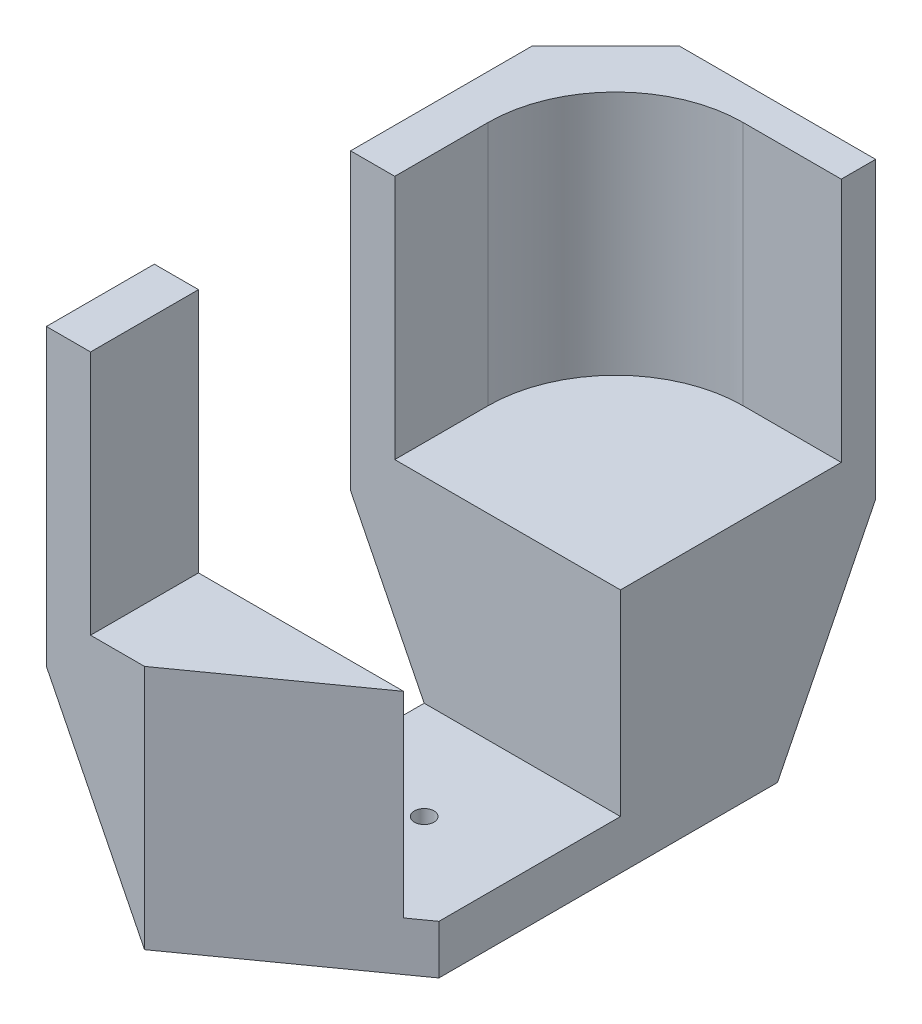
ISO-10303-21;
HEADER;
FILE_DESCRIPTION(('STEP AP214'),'2;1');
FILE_NAME('part.step','',(''),(''),'','','');
FILE_SCHEMA(('AUTOMOTIVE_DESIGN { 1 0 10303 214 1 1 1 1 }'));
ENDSEC;
DATA;
#1=APPLICATION_CONTEXT('core data for automotive mechanical design processes');
#2=APPLICATION_PROTOCOL_DEFINITION('international standard','automotive_design',2000,#1);
#3=PRODUCT_CONTEXT('',#1,'mechanical');
#4=PRODUCT('Part','Part','',(#3));
#5=PRODUCT_RELATED_PRODUCT_CATEGORY('part','',(#4));
#6=PRODUCT_DEFINITION_FORMATION('','',#4);
#7=PRODUCT_DEFINITION_CONTEXT('part definition',#1,'design');
#8=PRODUCT_DEFINITION('design','',#6,#7);
#9=PRODUCT_DEFINITION_SHAPE('','',#8);
#10=(LENGTH_UNIT() NAMED_UNIT(*) SI_UNIT(.MILLI.,.METRE.));
#11=(NAMED_UNIT(*) PLANE_ANGLE_UNIT() SI_UNIT($,.RADIAN.));
#12=(NAMED_UNIT(*) SI_UNIT($,.STERADIAN.) SOLID_ANGLE_UNIT());
#13=UNCERTAINTY_MEASURE_WITH_UNIT(LENGTH_MEASURE(1.E-05),#10,'distance_accuracy_value','');
#14=(GEOMETRIC_REPRESENTATION_CONTEXT(3) GLOBAL_UNCERTAINTY_ASSIGNED_CONTEXT((#13)) GLOBAL_UNIT_ASSIGNED_CONTEXT((#10,
#11,#12)) REPRESENTATION_CONTEXT('',''));
#15=CARTESIAN_POINT('',(0.,0.,0.));
#16=DIRECTION('',(0.,0.,1.));
#17=DIRECTION('',(1.,0.,0.));
#18=AXIS2_PLACEMENT_3D('',#15,#16,#17);
#19=CARTESIAN_POINT('',(-35.,50.,-72.));
#20=DIRECTION('',(1.,0.,0.));
#21=DIRECTION('',(0.,0.,-1.));
#22=AXIS2_PLACEMENT_3D('',#19,#20,#21);
#23=PLANE('',#22);
#24=DIRECTION('',(0.,-1.,0.));
#25=VECTOR('',#24,1.);
#26=CARTESIAN_POINT('',(-35.,50.,-57.));
#27=LINE('',#26,#25);
#28=CARTESIAN_POINT('',(-35.,100.,-57.));
#29=VERTEX_POINT('',#28);
#30=CARTESIAN_POINT('',(-35.,40.,-57.));
#31=VERTEX_POINT('',#30);
#32=EDGE_CURVE('E212',#29,#31,#27,.T.);
#33=ORIENTED_EDGE('',*,*,#32,.T.);
#34=DIRECTION('',(0.,0.,-1.));
#35=VECTOR('',#34,1.);
#36=CARTESIAN_POINT('',(-35.,40.,42.));
#37=LINE('',#36,#35);
#38=CARTESIAN_POINT('',(-35.,40.,-20.));
#39=VERTEX_POINT('',#38);
#40=EDGE_CURVE('E245',#39,#31,#37,.T.);
#41=ORIENTED_EDGE('',*,*,#40,.F.);
#42=DIRECTION('',(0.,-1.,0.));
#43=VECTOR('',#42,1.);
#44=CARTESIAN_POINT('',(-35.,100.,-20.));
#45=LINE('',#44,#43);
#46=CARTESIAN_POINT('',(-35.,100.,-20.));
#47=VERTEX_POINT('',#46);
#48=EDGE_CURVE('E262',#47,#39,#45,.T.);
#49=ORIENTED_EDGE('',*,*,#48,.F.);
#50=DIRECTION('',(0.,0.,1.));
#51=VECTOR('',#50,1.);
#52=CARTESIAN_POINT('',(-35.,100.,42.));
#53=LINE('',#52,#51);
#54=EDGE_CURVE('E290',#29,#47,#53,.T.);
#55=ORIENTED_EDGE('',*,*,#54,.F.);
#56=EDGE_LOOP('',(#33,#41,#49,#55));
#57=FACE_BOUND('',#56,.T.);
#58=ADVANCED_FACE('F41',(#57),#23,.F.);
#59=CARTESIAN_POINT('',(0.,50.,0.));
#60=DIRECTION('',(0.,1.,0.));
#61=DIRECTION('',(0.,0.,1.));
#62=AXIS2_PLACEMENT_3D('',#59,#60,#61);
#63=PLANE('',#62);
#64=DIRECTION('',(0.813733471206735,0.,-0.581238193719097));
#65=VECTOR('',#64,1.);
#66=CARTESIAN_POINT('',(-15.,50.,42.));
#67=LINE('',#66,#65);
#68=CARTESIAN_POINT('',(-15.,50.,42.));
#69=VERTEX_POINT('',#68);
#70=CARTESIAN_POINT('',(15.8,50.,20.));
#71=VERTEX_POINT('',#70);
#72=EDGE_CURVE('E196',#69,#71,#67,.T.);
#73=ORIENTED_EDGE('',*,*,#72,.T.);
#74=DIRECTION('',(-1.,0.,0.));
#75=VECTOR('',#74,1.);
#76=CARTESIAN_POINT('',(0.,50.,20.));
#77=LINE('',#76,#75);
#78=CARTESIAN_POINT('',(-26.,50.,20.));
#79=VERTEX_POINT('',#78);
#80=EDGE_CURVE('E278',#71,#79,#77,.T.);
#81=ORIENTED_EDGE('',*,*,#80,.T.);
#82=DIRECTION('',(0.,0.,-1.));
#83=VECTOR('',#82,1.);
#84=CARTESIAN_POINT('',(-26.,50.,-39.));
#85=LINE('',#84,#83);
#86=CARTESIAN_POINT('',(-26.,50.,42.));
#87=VERTEX_POINT('',#86);
#88=EDGE_CURVE('E310',#87,#79,#85,.T.);
#89=ORIENTED_EDGE('',*,*,#88,.F.);
#90=DIRECTION('',(1.,0.,0.));
#91=VECTOR('',#90,1.);
#92=CARTESIAN_POINT('',(-35.,50.,42.));
#93=LINE('',#92,#91);
#94=EDGE_CURVE('E193',#87,#69,#93,.T.);
#95=ORIENTED_EDGE('',*,*,#94,.T.);
#96=EDGE_LOOP('',(#73,#81,#89,#95));
#97=FACE_BOUND('',#96,.T.);
#98=ADVANCED_FACE('F380',(#97),#63,.T.);
#99=CARTESIAN_POINT('',(-26.,50.,-20.));
#100=VERTEX_POINT('',#99);
#101=CARTESIAN_POINT('',(-26.,50.,-39.));
#102=VERTEX_POINT('',#101);
#103=EDGE_CURVE('E284',#100,#102,#85,.T.);
#104=ORIENTED_EDGE('',*,*,#103,.F.);
#105=DIRECTION('',(1.,0.,0.));
#106=VECTOR('',#105,1.);
#107=CARTESIAN_POINT('',(0.,50.,-20.));
#108=LINE('',#107,#106);
#109=CARTESIAN_POINT('',(20.,50.,-20.));
#110=VERTEX_POINT('',#109);
#111=EDGE_CURVE('E273',#100,#110,#108,.T.);
#112=ORIENTED_EDGE('',*,*,#111,.T.);
#113=DIRECTION('',(0.,0.,-1.));
#114=VECTOR('',#113,1.);
#115=CARTESIAN_POINT('',(20.,50.,17.));
#116=LINE('',#115,#114);
#117=CARTESIAN_POINT('',(20.,50.,-65.));
#118=VERTEX_POINT('',#117);
#119=EDGE_CURVE('E204',#110,#118,#116,.T.);
#120=ORIENTED_EDGE('',*,*,#119,.T.);
#121=DIRECTION('',(1.,0.,0.));
#122=VECTOR('',#121,1.);
#123=CARTESIAN_POINT('',(20.,50.,-65.));
#124=LINE('',#123,#122);
#125=CARTESIAN_POINT('',(0.,50.,-65.));
#126=VERTEX_POINT('',#125);
#127=EDGE_CURVE('E289',#126,#118,#124,.T.);
#128=ORIENTED_EDGE('',*,*,#127,.F.);
#129=CARTESIAN_POINT('',(0.,50.,-39.));
#130=DIRECTION('',(0.,-1.,0.));
#131=DIRECTION('',(0.,0.,1.));
#132=AXIS2_PLACEMENT_3D('',#129,#130,#131);
#133=CIRCLE('',#132,26.);
#134=EDGE_CURVE('E313',#102,#126,#133,.T.);
#135=ORIENTED_EDGE('',*,*,#134,.F.);
#136=EDGE_LOOP('',(#104,#112,#120,#128,#135));
#137=FACE_BOUND('',#136,.T.);
#138=ADVANCED_FACE('F335',(#137),#63,.T.);
#139=DIRECTION('',(0.,-1.,0.));
#140=VECTOR('',#139,1.);
#141=CARTESIAN_POINT('',(-35.,100.,20.));
#142=LINE('',#141,#140);
#143=CARTESIAN_POINT('',(-35.,100.,20.));
#144=VERTEX_POINT('',#143);
#145=CARTESIAN_POINT('',(-35.,40.,20.));
#146=VERTEX_POINT('',#145);
#147=EDGE_CURVE('E268',#144,#146,#142,.T.);
#148=ORIENTED_EDGE('',*,*,#147,.T.);
#149=CARTESIAN_POINT('',(-35.,40.,42.));
#150=VERTEX_POINT('',#149);
#151=EDGE_CURVE('E241',#150,#146,#37,.T.);
#152=ORIENTED_EDGE('',*,*,#151,.F.);
#153=DIRECTION('',(0.,-1.,0.));
#154=VECTOR('',#153,1.);
#155=CARTESIAN_POINT('',(-35.,50.,42.));
#156=LINE('',#155,#154);
#157=CARTESIAN_POINT('',(-35.,100.,42.));
#158=VERTEX_POINT('',#157);
#159=EDGE_CURVE('E209',#158,#150,#156,.T.);
#160=ORIENTED_EDGE('',*,*,#159,.F.);
#161=EDGE_CURVE('E288',#144,#158,#53,.T.);
#162=ORIENTED_EDGE('',*,*,#161,.F.);
#163=EDGE_LOOP('',(#148,#152,#160,#162));
#164=FACE_BOUND('',#163,.T.);
#165=ADVANCED_FACE('F382',(#164),#23,.F.);
#166=CARTESIAN_POINT('',(-15.,50.,42.));
#167=DIRECTION('',(-0.581238193719097,0.,-0.813733471206735));
#168=DIRECTION('',(-0.813733471206735,0.,0.581238193719097));
#169=AXIS2_PLACEMENT_3D('',#166,#167,#168);
#170=PLANE('',#169);
#171=DIRECTION('',(0.,-1.,0.));
#172=VECTOR('',#171,1.);
#173=CARTESIAN_POINT('',(15.8,50.,20.));
#174=LINE('',#173,#172);
#175=CARTESIAN_POINT('',(15.8,10.,20.));
#176=VERTEX_POINT('',#175);
#177=EDGE_CURVE('E225',#71,#176,#174,.T.);
#178=ORIENTED_EDGE('',*,*,#177,.F.);
#179=ORIENTED_EDGE('',*,*,#72,.F.);
#180=DIRECTION('',(0.,-1.,0.));
#181=VECTOR('',#180,1.);
#182=CARTESIAN_POINT('',(-15.,50.,42.));
#183=LINE('',#182,#181);
#184=CARTESIAN_POINT('',(-15.,0.,42.));
#185=VERTEX_POINT('',#184);
#186=EDGE_CURVE('E206',#69,#185,#183,.T.);
#187=ORIENTED_EDGE('',*,*,#186,.T.);
#188=DIRECTION('',(0.813733471206735,0.,-0.581238193719097));
#189=VECTOR('',#188,1.);
#190=CARTESIAN_POINT('',(-15.,0.,42.));
#191=LINE('',#190,#189);
#192=CARTESIAN_POINT('',(20.,0.,17.));
#193=VERTEX_POINT('',#192);
#194=EDGE_CURVE('E194',#185,#193,#191,.T.);
#195=ORIENTED_EDGE('',*,*,#194,.T.);
#196=DIRECTION('',(0.,-1.,0.));
#197=VECTOR('',#196,1.);
#198=CARTESIAN_POINT('',(20.,50.,17.));
#199=LINE('',#198,#197);
#200=CARTESIAN_POINT('',(20.,10.,17.));
#201=VERTEX_POINT('',#200);
#202=EDGE_CURVE('E192',#201,#193,#199,.T.);
#203=ORIENTED_EDGE('',*,*,#202,.F.);
#204=DIRECTION('',(0.813733471206735,0.,-0.581238193719097));
#205=VECTOR('',#204,1.);
#206=CARTESIAN_POINT('',(-15.,10.,42.));
#207=LINE('',#206,#205);
#208=EDGE_CURVE('E224',#176,#201,#207,.T.);
#209=ORIENTED_EDGE('',*,*,#208,.F.);
#210=EDGE_LOOP('',(#178,#179,#187,#195,#203,#209));
#211=FACE_BOUND('',#210,.T.);
#212=ADVANCED_FACE('F391',(#211),#170,.F.);
#213=CARTESIAN_POINT('',(20.,50.,-14.0255727499082));
#214=DIRECTION('',(-1.,0.,0.));
#215=DIRECTION('',(0.,0.,1.));
#216=AXIS2_PLACEMENT_3D('',#213,#214,#215);
#217=PLANE('',#216);
#218=DIRECTION('',(0.,0.,-1.));
#219=VECTOR('',#218,1.);
#220=CARTESIAN_POINT('',(20.,0.,-14.0255727499082));
#221=LINE('',#220,#219);
#222=CARTESIAN_POINT('',(20.,0.,-52.));
#223=VERTEX_POINT('',#222);
#224=EDGE_CURVE('E178',#193,#223,#221,.T.);
#225=ORIENTED_EDGE('',*,*,#224,.T.);
#226=DIRECTION('',(0.,-0.894427190999916,0.447213595499958));
#227=VECTOR('',#226,1.);
#228=CARTESIAN_POINT('',(20.,40.,-72.));
#229=LINE('',#228,#227);
#230=CARTESIAN_POINT('',(20.,40.,-72.));
#231=VERTEX_POINT('',#230);
#232=EDGE_CURVE('E181',#231,#223,#229,.T.);
#233=ORIENTED_EDGE('',*,*,#232,.F.);
#234=DIRECTION('',(0.,-1.,0.));
#235=VECTOR('',#234,1.);
#236=CARTESIAN_POINT('',(20.,50.,-72.));
#237=LINE('',#236,#235);
#238=CARTESIAN_POINT('',(20.,100.,-72.));
#239=VERTEX_POINT('',#238);
#240=EDGE_CURVE('E202',#239,#231,#237,.T.);
#241=ORIENTED_EDGE('',*,*,#240,.F.);
#242=DIRECTION('',(0.,0.,-1.));
#243=VECTOR('',#242,1.);
#244=CARTESIAN_POINT('',(20.,100.,-72.));
#245=LINE('',#244,#243);
#246=CARTESIAN_POINT('',(20.,100.,-65.));
#247=VERTEX_POINT('',#246);
#248=EDGE_CURVE('E303',#247,#239,#245,.T.);
#249=ORIENTED_EDGE('',*,*,#248,.F.);
#250=DIRECTION('',(0.,-1.,0.));
#251=VECTOR('',#250,1.);
#252=CARTESIAN_POINT('',(20.,100.,-65.));
#253=LINE('',#252,#251);
#254=EDGE_CURVE('E309',#247,#118,#253,.T.);
#255=ORIENTED_EDGE('',*,*,#254,.T.);
#256=ORIENTED_EDGE('',*,*,#119,.F.);
#257=DIRECTION('',(0.,-1.,0.));
#258=VECTOR('',#257,1.);
#259=CARTESIAN_POINT('',(20.,100.,-20.));
#260=LINE('',#259,#258);
#261=CARTESIAN_POINT('',(20.,10.,-20.));
#262=VERTEX_POINT('',#261);
#263=EDGE_CURVE('E265',#110,#262,#260,.T.);
#264=ORIENTED_EDGE('',*,*,#263,.T.);
#265=DIRECTION('',(0.,0.,-1.));
#266=VECTOR('',#265,1.);
#267=CARTESIAN_POINT('',(20.,10.,-20.));
#268=LINE('',#267,#266);
#269=EDGE_CURVE('E255',#201,#262,#268,.T.);
#270=ORIENTED_EDGE('',*,*,#269,.F.);
#271=ORIENTED_EDGE('',*,*,#202,.T.);
#272=EDGE_LOOP('',(#225,#233,#241,#249,#255,#256,#264,#270,#271));
#273=FACE_BOUND('',#272,.T.);
#274=ADVANCED_FACE('F189',(#273),#217,.F.);
#275=CARTESIAN_POINT('',(0.,50.,0.));
#276=DIRECTION('',(0.,-1.,0.));
#277=DIRECTION('',(0.,0.,-1.));
#278=AXIS2_PLACEMENT_3D('',#275,#276,#277);
#279=CYLINDRICAL_SURFACE('',#278,2.);
#280=CARTESIAN_POINT('',(0.,0.,0.));
#281=DIRECTION('',(0.,1.,0.));
#282=DIRECTION('',(0.,0.,1.));
#283=AXIS2_PLACEMENT_3D('',#280,#281,#282);
#284=CIRCLE('',#283,2.);
#285=CARTESIAN_POINT('',(0.,0.,2.));
#286=VERTEX_POINT('',#285);
#287=EDGE_CURVE('E198',#286,#286,#284,.T.);
#288=ORIENTED_EDGE('',*,*,#287,.F.);
#289=EDGE_LOOP('',(#288));
#290=FACE_BOUND('',#289,.T.);
#291=CARTESIAN_POINT('',(0.,10.,0.));
#292=DIRECTION('',(0.,1.,0.));
#293=DIRECTION('',(0.,0.,1.));
#294=AXIS2_PLACEMENT_3D('',#291,#292,#293);
#295=CIRCLE('',#294,2.);
#296=CARTESIAN_POINT('',(0.,10.,2.));
#297=VERTEX_POINT('',#296);
#298=EDGE_CURVE('E221',#297,#297,#295,.T.);
#299=ORIENTED_EDGE('',*,*,#298,.T.);
#300=EDGE_LOOP('',(#299));
#301=FACE_BOUND('',#300,.T.);
#302=ADVANCED_FACE('F449',(#290,#301),#279,.F.);
#303=CARTESIAN_POINT('',(-26.,100.,-39.));
#304=DIRECTION('',(-1.,0.,0.));
#305=DIRECTION('',(0.,0.,1.));
#306=AXIS2_PLACEMENT_3D('',#303,#304,#305);
#307=PLANE('',#306);
#308=DIRECTION('',(0.,-1.,0.));
#309=VECTOR('',#308,1.);
#310=CARTESIAN_POINT('',(-26.,100.,20.));
#311=LINE('',#310,#309);
#312=CARTESIAN_POINT('',(-26.,100.,20.));
#313=VERTEX_POINT('',#312);
#314=EDGE_CURVE('E276',#313,#79,#311,.T.);
#315=ORIENTED_EDGE('',*,*,#314,.F.);
#316=DIRECTION('',(0.,0.,-1.));
#317=VECTOR('',#316,1.);
#318=CARTESIAN_POINT('',(-26.,100.,-39.));
#319=LINE('',#318,#317);
#320=CARTESIAN_POINT('',(-26.,100.,42.));
#321=VERTEX_POINT('',#320);
#322=EDGE_CURVE('E296',#321,#313,#319,.T.);
#323=ORIENTED_EDGE('',*,*,#322,.F.);
#324=DIRECTION('',(0.,-1.,0.));
#325=VECTOR('',#324,1.);
#326=CARTESIAN_POINT('',(-26.,100.,42.));
#327=LINE('',#326,#325);
#328=EDGE_CURVE('E326',#321,#87,#327,.T.);
#329=ORIENTED_EDGE('',*,*,#328,.T.);
#330=ORIENTED_EDGE('',*,*,#88,.T.);
#331=EDGE_LOOP('',(#315,#323,#329,#330));
#332=FACE_BOUND('',#331,.T.);
#333=ADVANCED_FACE('F414',(#332),#307,.F.);
#334=DIRECTION('',(0.,1.,0.));
#335=VECTOR('',#334,1.);
#336=CARTESIAN_POINT('',(-26.,100.,-20.));
#337=LINE('',#336,#335);
#338=CARTESIAN_POINT('',(-26.,100.,-20.));
#339=VERTEX_POINT('',#338);
#340=EDGE_CURVE('E271',#100,#339,#337,.T.);
#341=ORIENTED_EDGE('',*,*,#340,.F.);
#342=ORIENTED_EDGE('',*,*,#103,.T.);
#343=DIRECTION('',(0.,-1.,0.));
#344=VECTOR('',#343,1.);
#345=CARTESIAN_POINT('',(-26.,100.,-39.));
#346=LINE('',#345,#344);
#347=CARTESIAN_POINT('',(-26.,100.,-39.));
#348=VERTEX_POINT('',#347);
#349=EDGE_CURVE('E323',#348,#102,#346,.T.);
#350=ORIENTED_EDGE('',*,*,#349,.F.);
#351=EDGE_CURVE('E295',#339,#348,#319,.T.);
#352=ORIENTED_EDGE('',*,*,#351,.F.);
#353=EDGE_LOOP('',(#341,#342,#350,#352));
#354=FACE_BOUND('',#353,.T.);
#355=ADVANCED_FACE('F364',(#354),#307,.F.);
#356=CARTESIAN_POINT('',(0.,100.,-39.));
#357=DIRECTION('',(0.,1.,0.));
#358=DIRECTION('',(0.,0.,1.));
#359=AXIS2_PLACEMENT_3D('',#356,#357,#358);
#360=PLANE('',#359);
#361=ORIENTED_EDGE('',*,*,#322,.T.);
#362=DIRECTION('',(1.,0.,0.));
#363=VECTOR('',#362,1.);
#364=CARTESIAN_POINT('',(-35.,100.,20.));
#365=LINE('',#364,#363);
#366=EDGE_CURVE('E260',#144,#313,#365,.T.);
#367=ORIENTED_EDGE('',*,*,#366,.F.);
#368=ORIENTED_EDGE('',*,*,#161,.T.);
#369=DIRECTION('',(1.,0.,0.));
#370=VECTOR('',#369,1.);
#371=CARTESIAN_POINT('',(-26.,100.,42.));
#372=LINE('',#371,#370);
#373=EDGE_CURVE('E293',#158,#321,#372,.T.);
#374=ORIENTED_EDGE('',*,*,#373,.T.);
#375=EDGE_LOOP('',(#361,#367,#368,#374));
#376=FACE_BOUND('',#375,.T.);
#377=ADVANCED_FACE('F409',(#376),#360,.T.);
#378=ORIENTED_EDGE('',*,*,#54,.T.);
#379=DIRECTION('',(1.,0.,0.));
#380=VECTOR('',#379,1.);
#381=CARTESIAN_POINT('',(0.,100.,-20.));
#382=LINE('',#381,#380);
#383=EDGE_CURVE('E217',#47,#339,#382,.T.);
#384=ORIENTED_EDGE('',*,*,#383,.T.);
#385=ORIENTED_EDGE('',*,*,#351,.T.);
#386=CARTESIAN_POINT('',(0.,100.,-39.));
#387=DIRECTION('',(0.,-1.,0.));
#388=DIRECTION('',(0.,0.,1.));
#389=AXIS2_PLACEMENT_3D('',#386,#387,#388);
#390=CIRCLE('',#389,26.);
#391=CARTESIAN_POINT('',(0.,100.,-65.));
#392=VERTEX_POINT('',#391);
#393=EDGE_CURVE('E299',#348,#392,#390,.T.);
#394=ORIENTED_EDGE('',*,*,#393,.T.);
#395=DIRECTION('',(1.,0.,0.));
#396=VECTOR('',#395,1.);
#397=CARTESIAN_POINT('',(20.,100.,-65.));
#398=LINE('',#397,#396);
#399=EDGE_CURVE('E301',#392,#247,#398,.T.);
#400=ORIENTED_EDGE('',*,*,#399,.T.);
#401=ORIENTED_EDGE('',*,*,#248,.T.);
#402=DIRECTION('',(-1.,0.,0.));
#403=VECTOR('',#402,1.);
#404=CARTESIAN_POINT('',(-20.,100.,-72.));
#405=LINE('',#404,#403);
#406=CARTESIAN_POINT('',(-20.,100.,-72.));
#407=VERTEX_POINT('',#406);
#408=EDGE_CURVE('E306',#239,#407,#405,.T.);
#409=ORIENTED_EDGE('',*,*,#408,.T.);
#410=DIRECTION('',(-0.707106781186549,0.,0.707106781186546));
#411=VECTOR('',#410,1.);
#412=CARTESIAN_POINT('',(-35.,100.,-57.));
#413=LINE('',#412,#411);
#414=EDGE_CURVE('E285',#407,#29,#413,.T.);
#415=ORIENTED_EDGE('',*,*,#414,.T.);
#416=EDGE_LOOP('',(#378,#384,#385,#394,#400,#401,#409,#415));
#417=FACE_BOUND('',#416,.T.);
#418=ADVANCED_FACE('F345',(#417),#360,.T.);
#419=CARTESIAN_POINT('',(0.,0.,0.));
#420=DIRECTION('',(0.,1.,0.));
#421=DIRECTION('',(0.,0.,1.));
#422=AXIS2_PLACEMENT_3D('',#419,#420,#421);
#423=PLANE('',#422);
#424=DIRECTION('',(0.,0.,-1.));
#425=VECTOR('',#424,1.);
#426=CARTESIAN_POINT('',(-15.,0.,42.));
#427=LINE('',#426,#425);
#428=CARTESIAN_POINT('',(-15.,0.,-37.0000700401634));
#429=VERTEX_POINT('',#428);
#430=EDGE_CURVE('E234',#185,#429,#427,.T.);
#431=ORIENTED_EDGE('',*,*,#430,.T.);
#432=DIRECTION('',(-0.707106781186547,0.,0.707106781186548));
#433=VECTOR('',#432,1.);
#434=CARTESIAN_POINT('',(-15.,0.,-37.0000700401634));
#435=LINE('',#434,#433);
#436=CARTESIAN_POINT('',(-7.00401634745607E-05,0.,-52.));
#437=VERTEX_POINT('',#436);
#438=EDGE_CURVE('E64',#429,#437,#435,.F.);
#439=ORIENTED_EDGE('',*,*,#438,.T.);
#440=DIRECTION('',(1.,0.,0.));
#441=VECTOR('',#440,1.);
#442=CARTESIAN_POINT('',(-35.,0.,-52.));
#443=LINE('',#442,#441);
#444=EDGE_CURVE('E172',#437,#223,#443,.T.);
#445=ORIENTED_EDGE('',*,*,#444,.T.);
#446=ORIENTED_EDGE('',*,*,#224,.F.);
#447=ORIENTED_EDGE('',*,*,#194,.F.);
#448=EDGE_LOOP('',(#431,#439,#445,#446,#447));
#449=FACE_BOUND('',#448,.T.);
#450=ORIENTED_EDGE('',*,*,#287,.T.);
#451=EDGE_LOOP('',(#450));
#452=FACE_BOUND('',#451,.T.);
#453=ADVANCED_FACE('F174',(#449,#452),#423,.F.);
#454=CARTESIAN_POINT('',(20.,50.,-72.));
#455=DIRECTION('',(0.,0.,1.));
#456=DIRECTION('',(1.,0.,0.));
#457=AXIS2_PLACEMENT_3D('',#454,#455,#456);
#458=PLANE('',#457);
#459=ORIENTED_EDGE('',*,*,#240,.T.);
#460=DIRECTION('',(1.,0.,0.));
#461=VECTOR('',#460,1.);
#462=CARTESIAN_POINT('',(-35.,40.,-72.));
#463=LINE('',#462,#461);
#464=CARTESIAN_POINT('',(-20.,40.,-72.));
#465=VERTEX_POINT('',#464);
#466=EDGE_CURVE('E180',#465,#231,#463,.T.);
#467=ORIENTED_EDGE('',*,*,#466,.F.);
#468=DIRECTION('',(0.,1.,0.));
#469=VECTOR('',#468,1.);
#470=CARTESIAN_POINT('',(-20.,50.,-72.));
#471=LINE('',#470,#469);
#472=EDGE_CURVE('E215',#465,#407,#471,.T.);
#473=ORIENTED_EDGE('',*,*,#472,.T.);
#474=ORIENTED_EDGE('',*,*,#408,.F.);
#475=EDGE_LOOP('',(#459,#467,#473,#474));
#476=FACE_BOUND('',#475,.T.);
#477=ADVANCED_FACE('F348',(#476),#458,.F.);
#478=CARTESIAN_POINT('',(-35.,50.,42.));
#479=DIRECTION('',(0.,0.,-1.));
#480=DIRECTION('',(-1.,0.,0.));
#481=AXIS2_PLACEMENT_3D('',#478,#479,#480);
#482=PLANE('',#481);
#483=ORIENTED_EDGE('',*,*,#159,.T.);
#484=DIRECTION('',(0.447213595499958,-0.894427190999916,0.));
#485=VECTOR('',#484,1.);
#486=CARTESIAN_POINT('',(-15.,0.,42.));
#487=LINE('',#486,#485);
#488=EDGE_CURVE('E248',#150,#185,#487,.T.);
#489=ORIENTED_EDGE('',*,*,#488,.T.);
#490=ORIENTED_EDGE('',*,*,#186,.F.);
#491=ORIENTED_EDGE('',*,*,#94,.F.);
#492=ORIENTED_EDGE('',*,*,#328,.F.);
#493=ORIENTED_EDGE('',*,*,#373,.F.);
#494=EDGE_LOOP('',(#483,#489,#490,#491,#492,#493));
#495=FACE_BOUND('',#494,.T.);
#496=ADVANCED_FACE('F377',(#495),#482,.F.);
#497=CARTESIAN_POINT('',(-35.,50.,-57.));
#498=DIRECTION('',(0.707106781186546,0.,0.707106781186549));
#499=DIRECTION('',(0.,-1.,0.));
#500=AXIS2_PLACEMENT_3D('',#497,#498,#499);
#501=PLANE('',#500);
#502=DIRECTION('',(-0.408248290463864,-0.816496580927725,0.408248290463863));
#503=VECTOR('',#502,1.);
#504=CARTESIAN_POINT('',(-21.6666666666667,36.6666666666666,-70.3333333333333));
#505=LINE('',#504,#503);
#506=CARTESIAN_POINT('',(-20.0000350200817,39.9999299598365,-71.9999649799182));
#507=VERTEX_POINT('',#506);
#508=EDGE_CURVE('E352',#507,#465,#505,.F.);
#509=ORIENTED_EDGE('',*,*,#508,.F.);
#510=DIRECTION('',(-0.707106781186549,0.,0.707106781186546));
#511=VECTOR('',#510,1.);
#512=CARTESIAN_POINT('',(-35.,39.9999299598366,-57.));
#513=LINE('',#512,#511);
#514=CARTESIAN_POINT('',(-34.9999649799183,39.9999299598366,-57.0000350200817));
#515=VERTEX_POINT('',#514);
#516=EDGE_CURVE('E11',#507,#515,#513,.T.);
#517=ORIENTED_EDGE('',*,*,#516,.T.);
#518=DIRECTION('',(-0.408248290463863,0.816496580927727,0.408248290463862));
#519=VECTOR('',#518,1.);
#520=CARTESIAN_POINT('',(-38.3333333333333,46.6666666666667,-53.6666666666667));
#521=LINE('',#520,#519);
#522=EDGE_CURVE('E237',#31,#515,#521,.F.);
#523=ORIENTED_EDGE('',*,*,#522,.F.);
#524=ORIENTED_EDGE('',*,*,#32,.F.);
#525=ORIENTED_EDGE('',*,*,#414,.F.);
#526=ORIENTED_EDGE('',*,*,#472,.F.);
#527=EDGE_LOOP('',(#509,#517,#523,#524,#525,#526));
#528=FACE_BOUND('',#527,.T.);
#529=ADVANCED_FACE('F351',(#528),#501,.F.);
#530=CARTESIAN_POINT('',(0.,100.,-39.));
#531=DIRECTION('',(0.,-1.,0.));
#532=DIRECTION('',(0.,0.,-1.));
#533=AXIS2_PLACEMENT_3D('',#530,#531,#532);
#534=CYLINDRICAL_SURFACE('',#533,26.);
#535=ORIENTED_EDGE('',*,*,#134,.T.);
#536=DIRECTION('',(0.,-1.,0.));
#537=VECTOR('',#536,1.);
#538=CARTESIAN_POINT('',(0.,100.,-65.));
#539=LINE('',#538,#537);
#540=EDGE_CURVE('E320',#392,#126,#539,.T.);
#541=ORIENTED_EDGE('',*,*,#540,.F.);
#542=ORIENTED_EDGE('',*,*,#393,.F.);
#543=ORIENTED_EDGE('',*,*,#349,.T.);
#544=EDGE_LOOP('',(#535,#541,#542,#543));
#545=FACE_BOUND('',#544,.T.);
#546=ADVANCED_FACE('F368',(#545),#534,.F.);
#547=CARTESIAN_POINT('',(20.,100.,-65.));
#548=DIRECTION('',(0.,0.,-1.));
#549=DIRECTION('',(-1.,0.,0.));
#550=AXIS2_PLACEMENT_3D('',#547,#548,#549);
#551=PLANE('',#550);
#552=ORIENTED_EDGE('',*,*,#127,.T.);
#553=ORIENTED_EDGE('',*,*,#254,.F.);
#554=ORIENTED_EDGE('',*,*,#399,.F.);
#555=ORIENTED_EDGE('',*,*,#540,.T.);
#556=EDGE_LOOP('',(#552,#553,#554,#555));
#557=FACE_BOUND('',#556,.T.);
#558=ADVANCED_FACE('F339',(#557),#551,.F.);
#559=CARTESIAN_POINT('',(0.,10.,0.));
#560=DIRECTION('',(0.,1.,0.));
#561=DIRECTION('',(0.,0.,1.));
#562=AXIS2_PLACEMENT_3D('',#559,#560,#561);
#563=PLANE('',#562);
#564=DIRECTION('',(0.,0.,-1.));
#565=VECTOR('',#564,1.);
#566=CARTESIAN_POINT('',(-20.,10.,0.));
#567=LINE('',#566,#565);
#568=CARTESIAN_POINT('',(-20.,10.,20.));
#569=VERTEX_POINT('',#568);
#570=CARTESIAN_POINT('',(-20.,9.99999999999998,-20.));
#571=VERTEX_POINT('',#570);
#572=EDGE_CURVE('E240',#569,#571,#567,.T.);
#573=ORIENTED_EDGE('',*,*,#572,.F.);
#574=DIRECTION('',(1.,0.,0.));
#575=VECTOR('',#574,1.);
#576=CARTESIAN_POINT('',(-35.,10.,20.));
#577=LINE('',#576,#575);
#578=EDGE_CURVE('E253',#569,#176,#577,.T.);
#579=ORIENTED_EDGE('',*,*,#578,.T.);
#580=ORIENTED_EDGE('',*,*,#208,.T.);
#581=ORIENTED_EDGE('',*,*,#269,.T.);
#582=DIRECTION('',(-1.,0.,0.));
#583=VECTOR('',#582,1.);
#584=CARTESIAN_POINT('',(-35.,10.,-20.));
#585=LINE('',#584,#583);
#586=EDGE_CURVE('E257',#262,#571,#585,.T.);
#587=ORIENTED_EDGE('',*,*,#586,.T.);
#588=EDGE_LOOP('',(#573,#579,#580,#581,#587));
#589=FACE_BOUND('',#588,.T.);
#590=ORIENTED_EDGE('',*,*,#298,.F.);
#591=EDGE_LOOP('',(#590));
#592=FACE_BOUND('',#591,.T.);
#593=ADVANCED_FACE('F375',(#589,#592),#563,.T.);
#594=CARTESIAN_POINT('',(-35.,100.,20.));
#595=DIRECTION('',(0.,0.,-1.));
#596=DIRECTION('',(-1.,0.,0.));
#597=AXIS2_PLACEMENT_3D('',#594,#595,#596);
#598=PLANE('',#597);
#599=DIRECTION('',(0.447213595499958,-0.894427190999916,0.));
#600=VECTOR('',#599,1.);
#601=CARTESIAN_POINT('',(-59.,88.,20.));
#602=LINE('',#601,#600);
#603=EDGE_CURVE('E243',#146,#569,#602,.T.);
#604=ORIENTED_EDGE('',*,*,#603,.F.);
#605=ORIENTED_EDGE('',*,*,#147,.F.);
#606=ORIENTED_EDGE('',*,*,#366,.T.);
#607=ORIENTED_EDGE('',*,*,#314,.T.);
#608=ORIENTED_EDGE('',*,*,#80,.F.);
#609=ORIENTED_EDGE('',*,*,#177,.T.);
#610=ORIENTED_EDGE('',*,*,#578,.F.);
#611=EDGE_LOOP('',(#604,#605,#606,#607,#608,#609,#610));
#612=FACE_BOUND('',#611,.T.);
#613=ADVANCED_FACE('F405',(#612),#598,.T.);
#614=CARTESIAN_POINT('',(-35.,100.,-20.));
#615=DIRECTION('',(0.,0.,1.));
#616=DIRECTION('',(1.,0.,0.));
#617=AXIS2_PLACEMENT_3D('',#614,#615,#616);
#618=PLANE('',#617);
#619=DIRECTION('',(-0.447213595499958,0.894427190999916,0.));
#620=VECTOR('',#619,1.);
#621=CARTESIAN_POINT('',(-59.,88.,-20.));
#622=LINE('',#621,#620);
#623=EDGE_CURVE('E220',#571,#39,#622,.T.);
#624=ORIENTED_EDGE('',*,*,#623,.F.);
#625=ORIENTED_EDGE('',*,*,#586,.F.);
#626=ORIENTED_EDGE('',*,*,#263,.F.);
#627=ORIENTED_EDGE('',*,*,#111,.F.);
#628=ORIENTED_EDGE('',*,*,#340,.T.);
#629=ORIENTED_EDGE('',*,*,#383,.F.);
#630=ORIENTED_EDGE('',*,*,#48,.T.);
#631=EDGE_LOOP('',(#624,#625,#626,#627,#628,#629,#630));
#632=FACE_BOUND('',#631,.T.);
#633=ADVANCED_FACE('F360',(#632),#618,.T.);
#634=CARTESIAN_POINT('',(-15.,0.,42.));
#635=DIRECTION('',(0.894427190999916,0.447213595499958,0.));
#636=DIRECTION('',(-0.447213595499958,0.894427190999916,0.));
#637=AXIS2_PLACEMENT_3D('',#634,#635,#636);
#638=PLANE('',#637);
#639=ORIENTED_EDGE('',*,*,#522,.T.);
#640=DIRECTION('',(0.408248290463863,-0.816496580927726,0.408248290463863));
#641=VECTOR('',#640,1.);
#642=CARTESIAN_POINT('',(-1.83332165997277,-26.3333566800545,-23.8333917001362));
#643=LINE('',#642,#641);
#644=EDGE_CURVE('E227',#515,#429,#643,.T.);
#645=ORIENTED_EDGE('',*,*,#644,.T.);
#646=ORIENTED_EDGE('',*,*,#430,.F.);
#647=ORIENTED_EDGE('',*,*,#488,.F.);
#648=ORIENTED_EDGE('',*,*,#151,.T.);
#649=ORIENTED_EDGE('',*,*,#603,.T.);
#650=ORIENTED_EDGE('',*,*,#572,.T.);
#651=ORIENTED_EDGE('',*,*,#623,.T.);
#652=ORIENTED_EDGE('',*,*,#40,.T.);
#653=EDGE_LOOP('',(#639,#645,#646,#647,#648,#649,#650,#651,#652));
#654=FACE_BOUND('',#653,.T.);
#655=ADVANCED_FACE('F233',(#654),#638,.F.);
#656=CARTESIAN_POINT('',(-35.,40.,-72.));
#657=DIRECTION('',(0.,0.447213595499958,0.894427190999916));
#658=DIRECTION('',(0.,-0.894427190999916,0.447213595499958));
#659=AXIS2_PLACEMENT_3D('',#656,#657,#658);
#660=PLANE('',#659);
#661=ORIENTED_EDGE('',*,*,#444,.F.);
#662=DIRECTION('',(-0.408248290463863,0.816496580927726,-0.408248290463863));
#663=VECTOR('',#662,1.);
#664=CARTESIAN_POINT('',(-22.5000583668029,44.9999766532788,-74.4999883266394));
#665=LINE('',#664,#663);
#666=EDGE_CURVE('E50',#437,#507,#665,.T.);
#667=ORIENTED_EDGE('',*,*,#666,.T.);
#668=ORIENTED_EDGE('',*,*,#508,.T.);
#669=ORIENTED_EDGE('',*,*,#466,.T.);
#670=ORIENTED_EDGE('',*,*,#232,.T.);
#671=EDGE_LOOP('',(#661,#667,#668,#669,#670));
#672=FACE_BOUND('',#671,.T.);
#673=ADVANCED_FACE('F184',(#672),#660,.F.);
#674=CARTESIAN_POINT('',(-1.83332165997277,-26.3333566800545,-23.8333917001362));
#675=DIRECTION('',(0.577350269189626,0.577350269189626,0.577350269189626));
#676=DIRECTION('',(0.408248290463863,-0.816496580927726,0.408248290463863));
#677=AXIS2_PLACEMENT_3D('',#674,#675,#676);
#678=PLANE('',#677);
#679=ORIENTED_EDGE('',*,*,#516,.F.);
#680=ORIENTED_EDGE('',*,*,#666,.F.);
#681=ORIENTED_EDGE('',*,*,#438,.F.);
#682=ORIENTED_EDGE('',*,*,#644,.F.);
#683=EDGE_LOOP('',(#679,#680,#681,#682));
#684=FACE_BOUND('',#683,.T.);
#685=ADVANCED_FACE('F44',(#684),#678,.F.);
#686=CLOSED_SHELL('',(#58,#98,#138,#165,#212,#274,#302,#333,#355,#377,#418,#453,#477,#496,#529,
#546,#558,#593,#613,#633,#655,#673,#685));
#687=MANIFOLD_SOLID_BREP('B2',#686);
#688=ADVANCED_BREP_SHAPE_REPRESENTATION('',(#18,#687),#14);
#689=SHAPE_DEFINITION_REPRESENTATION(#9,#688);
ENDSEC;
END-ISO-10303-21;
